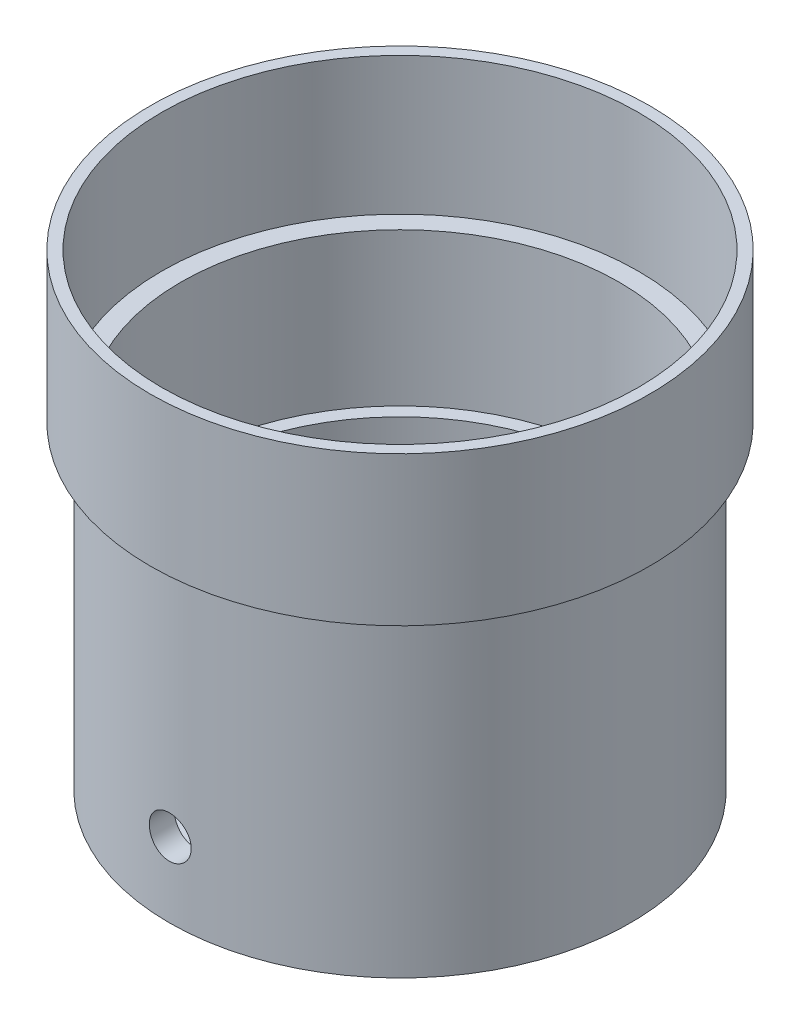
ISO-10303-21;
HEADER;
FILE_DESCRIPTION(('STEP AP214'),'2;1');
FILE_NAME('part.step','',(''),(''),'','','');
FILE_SCHEMA(('AUTOMOTIVE_DESIGN { 1 0 10303 214 1 1 1 1 }'));
ENDSEC;
DATA;
#1=APPLICATION_CONTEXT('core data for automotive mechanical design processes');
#2=APPLICATION_PROTOCOL_DEFINITION('international standard','automotive_design',2000,#1);
#3=PRODUCT_CONTEXT('',#1,'mechanical');
#4=PRODUCT('Part','Part','',(#3));
#5=PRODUCT_RELATED_PRODUCT_CATEGORY('part','',(#4));
#6=PRODUCT_DEFINITION_FORMATION('','',#4);
#7=PRODUCT_DEFINITION_CONTEXT('part definition',#1,'design');
#8=PRODUCT_DEFINITION('design','',#6,#7);
#9=PRODUCT_DEFINITION_SHAPE('','',#8);
#10=(LENGTH_UNIT() NAMED_UNIT(*) SI_UNIT(.MILLI.,.METRE.));
#11=(NAMED_UNIT(*) PLANE_ANGLE_UNIT() SI_UNIT($,.RADIAN.));
#12=(NAMED_UNIT(*) SI_UNIT($,.STERADIAN.) SOLID_ANGLE_UNIT());
#13=UNCERTAINTY_MEASURE_WITH_UNIT(LENGTH_MEASURE(1.E-05),#10,'distance_accuracy_value','');
#14=(GEOMETRIC_REPRESENTATION_CONTEXT(3) GLOBAL_UNCERTAINTY_ASSIGNED_CONTEXT((#13)) GLOBAL_UNIT_ASSIGNED_CONTEXT((#10,
#11,#12)) REPRESENTATION_CONTEXT('',''));
#15=CARTESIAN_POINT('',(0.,0.,0.));
#16=DIRECTION('',(0.,0.,1.));
#17=DIRECTION('',(1.,0.,0.));
#18=AXIS2_PLACEMENT_3D('',#15,#16,#17);
#19=CARTESIAN_POINT('',(0.,0.,0.));
#20=DIRECTION('',(0.,-1.,0.));
#21=DIRECTION('',(0.,0.,-1.));
#22=AXIS2_PLACEMENT_3D('',#19,#20,#21);
#23=CYLINDRICAL_SURFACE('',#22,60.475);
#24=CARTESIAN_POINT('',(0.,-4.,0.));
#25=DIRECTION('',(0.,-1.,0.));
#26=DIRECTION('',(0.,0.,-1.));
#27=AXIS2_PLACEMENT_3D('',#24,#25,#26);
#28=CIRCLE('',#27,60.475);
#29=CARTESIAN_POINT('',(0.,-4.,-60.475));
#30=VERTEX_POINT('',#29);
#31=EDGE_CURVE('E76',#30,#30,#28,.T.);
#32=ORIENTED_EDGE('',*,*,#31,.F.);
#33=EDGE_LOOP('',(#32));
#34=FACE_BOUND('',#33,.T.);
#35=CARTESIAN_POINT('',(0.,79.5,0.));
#36=DIRECTION('',(0.,-1.,0.));
#37=DIRECTION('',(0.,0.,-1.));
#38=AXIS2_PLACEMENT_3D('',#35,#36,#37);
#39=CIRCLE('',#38,60.475);
#40=CARTESIAN_POINT('',(0.,79.5,-60.475));
#41=VERTEX_POINT('',#40);
#42=EDGE_CURVE('E10',#41,#41,#39,.T.);
#43=ORIENTED_EDGE('',*,*,#42,.T.);
#44=EDGE_LOOP('',(#43));
#45=FACE_BOUND('',#44,.T.);
#46=CARTESIAN_POINT('',(-5.5,15.5,60.2243773317749));
#47=CARTESIAN_POINT('',(-5.50000144194168,15.6541803315462,60.2243769684878));
#48=CARTESIAN_POINT('',(-5.49351435754736,15.8083383862626,60.224970628469));
#49=CARTESIAN_POINT('',(-5.46761368127068,16.1156053969008,60.2273276979731));
#50=CARTESIAN_POINT('',(-5.44819693684003,16.2687140877633,60.2290913927769));
#51=CARTESIAN_POINT('',(-5.39655263206254,16.5728631732379,60.2337406625212));
#52=CARTESIAN_POINT('',(-5.36431464859518,16.7239017813601,60.2366271502024));
#53=CARTESIAN_POINT('',(-5.28724890009706,17.0227678330429,60.2434404708375));
#54=CARTESIAN_POINT('',(-5.24241652848806,17.1705940802819,60.2473676844219));
#55=CARTESIAN_POINT('',(-5.14054021720708,17.4617893298028,60.2561455806451));
#56=CARTESIAN_POINT('',(-5.08350798342523,17.6051624549355,60.2609953775655));
#57=CARTESIAN_POINT('',(-4.95759298181546,17.8866402354138,60.271484856631));
#58=CARTESIAN_POINT('',(-4.88870585083432,18.0247429280499,60.2771248294552));
#59=CARTESIAN_POINT('',(-4.73963062986568,18.2945743798621,60.2890297771893));
#60=CARTESIAN_POINT('',(-4.65944911776369,18.4263067895469,60.2952943876922));
#61=CARTESIAN_POINT('',(-4.48829136107303,18.6826083461509,60.3082766379306));
#62=CARTESIAN_POINT('',(-4.39731113085889,18.8071748229031,60.314994444536));
#63=CARTESIAN_POINT('',(-4.20499749490853,19.048500667894,60.3287073651363));
#64=CARTESIAN_POINT('',(-4.10364051668548,19.1652412170232,60.3357030873876));
#65=CARTESIAN_POINT('',(-3.89142517159073,19.389818322349,60.3497617567296));
#66=CARTESIAN_POINT('',(-3.78056330709322,19.497651571913,60.3568247277095));
#67=CARTESIAN_POINT('',(-3.55018785333809,19.7035731796975,60.3708133155754));
#68=CARTESIAN_POINT('',(-3.43067707639296,19.8016646811877,60.3777389761848));
#69=CARTESIAN_POINT('',(-3.18376656973002,19.9874840407185,60.391262159261));
#70=CARTESIAN_POINT('',(-3.0563639450787,20.075208060974,60.3978595596941));
#71=CARTESIAN_POINT('',(-2.79442635305351,20.2397397610876,60.4105455821035));
#72=CARTESIAN_POINT('',(-2.6598818949265,20.3165323890479,60.4166334978882));
#73=CARTESIAN_POINT('',(-2.38472484990477,20.4585350171856,60.4281199786119));
#74=CARTESIAN_POINT('',(-2.24411003506828,20.5237407190287,60.4335182875235));
#75=CARTESIAN_POINT('',(-1.95789773152687,20.6420416287933,60.4434672422761));
#76=CARTESIAN_POINT('',(-1.8123021859682,20.6951414990043,60.4480182143256));
#77=CARTESIAN_POINT('',(-1.51711480578658,20.7888931502244,60.456148308385));
#78=CARTESIAN_POINT('',(-1.36752152060262,20.8295403442895,60.459727072227));
#79=CARTESIAN_POINT('',(-0.915288255428919,20.9320685921761,60.4688192176509));
#80=CARTESIAN_POINT('',(-0.608074651657578,20.9749979406864,60.4727285941149));
#81=CARTESIAN_POINT('',(0.00905334258165068,21.0086796522335,60.4757880295455));
#82=CARTESIAN_POINT('',(0.318967674068777,20.9994331518933,60.474938192189));
#83=CARTESIAN_POINT('',(0.931938416084447,20.9292097248113,60.4685929908865));
#84=CARTESIAN_POINT('',(1.23501239252568,20.8683858136857,60.4631113683103));
#85=CARTESIAN_POINT('',(1.82662000204596,20.6969540805659,60.4481325550474));
#86=CARTESIAN_POINT('',(2.11515347453505,20.58634570887,60.4386353200218));
#87=CARTESIAN_POINT('',(2.66998931641287,20.3183202954448,60.4166703511368));
#88=CARTESIAN_POINT('',(2.936258570487,20.1608350624714,60.4041982951265));
#89=CARTESIAN_POINT('',(3.43864221756736,19.8035745635336,60.3776842038219));
#90=CARTESIAN_POINT('',(3.67475588010329,19.6037982734485,60.363642130512));
#91=CARTESIAN_POINT('',(4.11102259328823,19.1667650769358,60.3355051530854));
#92=CARTESIAN_POINT('',(4.31104237150202,18.929375107772,60.3214102417353));
#93=CARTESIAN_POINT('',(4.66841263298923,18.424315774095,60.2948071086337));
#94=CARTESIAN_POINT('',(4.82576307053349,18.1566463771314,60.2822988885826));
#95=CARTESIAN_POINT('',(5.09332497426873,17.5985289467483,60.2602835973969));
#96=CARTESIAN_POINT('',(5.20352895260322,17.3080773036873,60.2507770030469));
#97=CARTESIAN_POINT('',(5.37356801390697,16.7126874606261,60.2358509683223));
#98=CARTESIAN_POINT('',(5.43340436152038,16.4077496245524,60.2304314253292));
#99=CARTESIAN_POINT('',(5.50083973891706,15.7932113105547,60.2243103070085));
#100=CARTESIAN_POINT('',(5.50862487947157,15.4836314156615,60.2235919227321));
#101=CARTESIAN_POINT('',(5.4722249032703,14.8675711977102,60.2269101028749));
#102=CARTESIAN_POINT('',(5.42804036545704,14.5610908401616,60.2309466143245));
#103=CARTESIAN_POINT('',(5.28911068724888,13.9604673947471,60.2433044666382));
#104=CARTESIAN_POINT('',(5.19445289830432,13.666303936409,60.2516184039118));
#105=CARTESIAN_POINT('',(4.95735258918094,13.0980325566026,60.2715882637784));
#106=CARTESIAN_POINT('',(4.81490915899044,12.8239250171928,60.2832442500156));
#107=CARTESIAN_POINT('',(4.48581241822947,12.3026961508955,60.3086256160049));
#108=CARTESIAN_POINT('',(4.29903538869897,12.0556532231758,60.3223567470561));
#109=CARTESIAN_POINT('',(3.88675035252676,11.596359855306,60.3503220657683));
#110=CARTESIAN_POINT('',(3.66124155283631,11.3841101277348,60.364556263725));
#111=CARTESIAN_POINT('',(3.17709284735999,10.9997896238373,60.3919743362026));
#112=CARTESIAN_POINT('',(2.91835658538405,10.8278399808376,60.4051549676323));
#113=CARTESIAN_POINT('',(2.37556043504848,10.5298344396475,60.4289335281881));
#114=CARTESIAN_POINT('',(2.09150084101561,10.4037780081384,60.4395314873267));
#115=CARTESIAN_POINT('',(1.50660819591552,10.2013380870268,60.4569370777865));
#116=CARTESIAN_POINT('',(1.20580091395813,10.1248804561308,60.4637503643119));
#117=CARTESIAN_POINT('',(0.595384792994582,10.0235883129392,60.4728372759292));
#118=CARTESIAN_POINT('',(0.285776155785266,9.99875261802575,60.4751110050188));
#119=CARTESIAN_POINT('',(-0.177597204593095,10.0006967187348,60.4749378527973));
#120=CARTESIAN_POINT('',(-0.331686319593113,10.0078437873047,60.4742859423681));
#121=CARTESIAN_POINT('',(-0.638696704630235,10.0350417742214,60.4718212990253));
#122=CARTESIAN_POINT('',(-0.79161838645268,10.05508790764,60.4700089965621));
#123=CARTESIAN_POINT('',(-1.09526665726559,10.1079538085662,60.4652718972172));
#124=CARTESIAN_POINT('',(-1.2459924192718,10.1407782656566,60.4623466919144));
#125=CARTESIAN_POINT('',(-1.54408184207406,10.2189451579375,60.4554683132502));
#126=CARTESIAN_POINT('',(-1.6914467131662,10.2642830073142,60.4515155165035));
#127=CARTESIAN_POINT('',(-1.981866188213,10.3671697303595,60.4426914263128));
#128=CARTESIAN_POINT('',(-2.1249196028145,10.424721938886,60.4378198820659));
#129=CARTESIAN_POINT('',(-2.40561626560247,10.5515938707401,60.4272980997014));
#130=CARTESIAN_POINT('',(-2.54326147200452,10.6209092855522,60.421648146834));
#131=CARTESIAN_POINT('',(-2.81227884835731,10.7708552947685,60.4097247988));
#132=CARTESIAN_POINT('',(-2.94364880577517,10.8514898411864,60.4034511861102));
#133=CARTESIAN_POINT('',(-3.19909845796093,11.0234536627207,60.3904607302381));
#134=CARTESIAN_POINT('',(-3.32318078672044,11.114779037647,60.3837440490825));
#135=CARTESIAN_POINT('',(-3.56370134999259,11.3078755232719,60.3700275469708));
#136=CARTESIAN_POINT('',(-3.68010848554904,11.4096853036774,60.3630267400639));
#137=CARTESIAN_POINT('',(-3.90389660234442,11.6227010742974,60.3489667271439));
#138=CARTESIAN_POINT('',(-4.01128086823052,11.7339036153903,60.341907543419));
#139=CARTESIAN_POINT('',(-4.21637794407548,11.9650258824869,60.3279235266718));
#140=CARTESIAN_POINT('',(-4.31408481391058,12.0849508851009,60.3209987782385));
#141=CARTESIAN_POINT('',(-4.49902756305204,12.3325685616302,60.3074868718415));
#142=CARTESIAN_POINT('',(-4.58626729422208,12.4602583519092,60.300899590206));
#143=CARTESIAN_POINT('',(-4.74990592008288,12.7228808225798,60.2882308062477));
#144=CARTESIAN_POINT('',(-4.82627676004448,12.8578310504918,60.2821506290082));
#145=CARTESIAN_POINT('',(-4.96733970651611,13.1336685243862,60.2706907995833));
#146=CARTESIAN_POINT('',(-5.03203608723124,13.2745535741396,60.2653108912202));
#147=CARTESIAN_POINT('',(-5.14926893615989,13.5611904248172,60.2554073609372));
#148=CARTESIAN_POINT('',(-5.20181551045435,13.7069380647654,60.2508830279335));
#149=CARTESIAN_POINT('',(-5.29442341206908,14.0023221279602,60.2428158466783));
#150=CARTESIAN_POINT('',(-5.33448784373703,14.1519575742515,60.2392727544135));
#151=CARTESIAN_POINT('',(-5.41192797052756,14.4992817005471,60.2323718968821));
#152=CARTESIAN_POINT('',(-5.44492389239092,14.6979699993886,60.2293857851102));
#153=CARTESIAN_POINT('',(-5.48895893039545,15.0977848355471,60.2253887427393));
#154=CARTESIAN_POINT('',(-5.4999981193575,15.2989113647752,60.2243778055895));
#155=CARTESIAN_POINT('',(-5.5,15.5,60.2243773317749));
#156=B_SPLINE_CURVE_WITH_KNOTS('',3,(#46,#47,#48,#49,#50,#51,#52,#53,#54,#55,#56,#57,#58,#59,
#60,#61,#62,#63,#64,#65,#66,#67,#68,#69,#70,#71,#72,#73,#74,#75,#76,#77,#78,#79,#80,#81,#82,#83,
#84,#85,#86,#87,#88,#89,#90,#91,#92,#93,#94,#95,#96,#97,#98,#99,#100,#101,#102,#103,#104,#105,
#106,#107,#108,#109,#110,#111,#112,#113,#114,#115,#116,#117,#118,#119,#120,#121,#122,#123,#124,
#125,#126,#127,#128,#129,#130,#131,#132,#133,#134,#135,#136,#137,#138,#139,#140,#141,#142,#143,
#144,#145,#146,#147,#148,#149,#150,#151,#152,#153,#154,#155),.UNSPECIFIED.,.T.,.F.,(4,2,2,2,2,2,
2,2,2,2,2,2,2,2,2,2,2,2,2,2,2,2,2,2,2,2,2,2,2,2,2,2,2,2,2,2,2,2,2,2,2,2,2,2,2,2,2,2,2,2,2,2,2,2,
4),(0.,0.462365174282423,0.924843125119683,1.38769782187072,1.85072203529113,2.31330394934615,
2.77605648058929,3.23854060903502,3.7011959665194,4.16492667897097,4.62882877440598,
5.09258069766596,5.55650375624409,6.02105955594189,6.48578733104917,6.95033582318753,
7.41505522661891,8.3409033953241,9.26673139499885,10.1898222952546,11.1129233881872,
12.0373739236104,12.9618468481028,13.8896663864806,14.817486919208,15.7454547548355,
16.6733992900996,17.5980241470867,18.5226387038449,19.4456582469941,20.368695368776,
21.2943392801033,22.220002146626,23.1484126594543,24.0768123830056,25.0038210982645,
25.9308085762483,26.3931272884561,26.8552746016058,27.3175916807129,27.779739557789,
28.2420137767232,28.7041190422465,29.1663860524904,29.6284849426227,30.0923537749475,
30.5560530041417,31.0200351172054,31.4838459596501,31.9488330799651,32.4136496141688,
32.8780781167406,33.3423910221253,33.9454296153304,34.5484662085166),.UNSPECIFIED.);
#157=CARTESIAN_POINT('',(-5.5,15.5,60.2243773317749));
#158=VERTEX_POINT('',#157);
#159=EDGE_CURVE('E79',#158,#158,#156,.T.);
#160=ORIENTED_EDGE('',*,*,#159,.T.);
#161=EDGE_LOOP('',(#160));
#162=FACE_BOUND('',#161,.T.);
#163=ADVANCED_FACE('F36',(#34,#45,#162),#23,.T.);
#164=CARTESIAN_POINT('',(0.,0.,0.));
#165=DIRECTION('',(0.,-1.,0.));
#166=DIRECTION('',(0.,0.,-1.));
#167=AXIS2_PLACEMENT_3D('',#164,#165,#166);
#168=CYLINDRICAL_SURFACE('',#167,53.975);
#169=CARTESIAN_POINT('',(0.,42.5,0.));
#170=DIRECTION('',(0.,-1.,0.));
#171=DIRECTION('',(0.,0.,-1.));
#172=AXIS2_PLACEMENT_3D('',#169,#170,#171);
#173=CIRCLE('',#172,53.975);
#174=CARTESIAN_POINT('',(0.,42.5,-53.975));
#175=VERTEX_POINT('',#174);
#176=EDGE_CURVE('E70',#175,#175,#173,.T.);
#177=ORIENTED_EDGE('',*,*,#176,.F.);
#178=EDGE_LOOP('',(#177));
#179=FACE_BOUND('',#178,.T.);
#180=CARTESIAN_POINT('',(0.,0.,0.));
#181=DIRECTION('',(0.,-1.,0.));
#182=DIRECTION('',(0.,0.,-1.));
#183=AXIS2_PLACEMENT_3D('',#180,#181,#182);
#184=CIRCLE('',#183,53.975);
#185=CARTESIAN_POINT('',(0.,0.,-53.975));
#186=VERTEX_POINT('',#185);
#187=EDGE_CURVE('E73',#186,#186,#184,.T.);
#188=ORIENTED_EDGE('',*,*,#187,.T.);
#189=EDGE_LOOP('',(#188));
#190=FACE_BOUND('',#189,.T.);
#191=CARTESIAN_POINT('',(-5.5,15.5,53.6940464576847));
#192=CARTESIAN_POINT('',(-5.50000153240428,15.3459076315923,53.6940460256617));
#193=CARTESIAN_POINT('',(-5.4935218031051,15.1918385855872,53.6947111448561));
#194=CARTESIAN_POINT('',(-5.46765111703409,14.8847502316576,53.6973518217362));
#195=CARTESIAN_POINT('',(-5.44825707496244,14.7317311834113,53.6993276925672));
#196=CARTESIAN_POINT('',(-5.39667472743171,14.4277650210896,53.7045360842844));
#197=CARTESIAN_POINT('',(-5.36447626376089,14.2768196507378,53.7077696028633));
#198=CARTESIAN_POINT('',(-5.28750717870828,13.9781395947648,53.7154017743754));
#199=CARTESIAN_POINT('',(-5.2427319555295,13.8304061057184,53.7198008537502));
#200=CARTESIAN_POINT('',(-5.14098989854649,13.5393982412645,53.7296329300752));
#201=CARTESIAN_POINT('',(-5.08403509734705,13.396119623609,53.7350649060102));
#202=CARTESIAN_POINT('',(-4.95829474318958,13.1148257568675,53.7468131543168));
#203=CARTESIAN_POINT('',(-4.88950483388677,12.9768124688142,53.7531297521461));
#204=CARTESIAN_POINT('',(-4.74064278973354,12.7071498380514,53.7664626799588));
#205=CARTESIAN_POINT('',(-4.66057711419056,12.5754969094071,53.7734786086639));
#206=CARTESIAN_POINT('',(-4.48966909749034,12.3193418094352,53.7880177283907));
#207=CARTESIAN_POINT('',(-4.39882277422464,12.1948423057682,53.7955411064063));
#208=CARTESIAN_POINT('',(-4.2067293932701,11.9535540787597,53.8109037375464));
#209=CARTESIAN_POINT('',(-4.10545208434623,11.8367894938543,53.8187438669218));
#210=CARTESIAN_POINT('',(-3.89339644764286,11.6121561317142,53.8345000329384));
#211=CARTESIAN_POINT('',(-3.7826146216183,11.5042906588002,53.8424160965675));
#212=CARTESIAN_POINT('',(-3.55239669273259,11.2982945645204,53.8580950865359));
#213=CARTESIAN_POINT('',(-3.43296338877997,11.2001608188911,53.8658580613772));
#214=CARTESIAN_POINT('',(-3.18620252022825,11.0142462772381,53.8810172653351));
#215=CARTESIAN_POINT('',(-3.05887205908591,10.9264693145789,53.8884133580739));
#216=CARTESIAN_POINT('',(-2.79701134388464,10.7617838222323,53.9026397474969));
#217=CARTESIAN_POINT('',(-2.66246843416988,10.6848953203395,53.9094689922382));
#218=CARTESIAN_POINT('',(-2.38729859867522,10.542702062064,53.9223554053862));
#219=CARTESIAN_POINT('',(-2.24666943753227,10.4774016074373,53.9284122868397));
#220=CARTESIAN_POINT('',(-1.96041274690425,10.3589150293598,53.9395762896411));
#221=CARTESIAN_POINT('',(-1.81478718597118,10.3057241964509,53.944683780067));
#222=CARTESIAN_POINT('',(-1.5195245225479,10.2117968285308,53.9538095619937));
#223=CARTESIAN_POINT('',(-1.36988596520419,10.1710648785527,53.9578274524458));
#224=CARTESIAN_POINT('',(-0.917710378979365,10.0683448329436,53.9680331448027));
#225=CARTESIAN_POINT('',(-0.610587826867867,10.0252855589828,53.9724262545292));
#226=CARTESIAN_POINT('',(0.00638683431665454,9.99132055965389,53.975882862156));
#227=CARTESIAN_POINT('',(0.316238869890342,10.0004134341969,53.9749465031325));
#228=CARTESIAN_POINT('',(0.928869386473039,10.0702815942413,53.9678726514243));
#229=CARTESIAN_POINT('',(1.2316698473869,10.1308649927705,53.9617544698538));
#230=CARTESIAN_POINT('',(1.82277056315143,10.3017136671312,53.9450242504474));
#231=CARTESIAN_POINT('',(2.11107062341695,10.4119796094698,53.9344121523245));
#232=CARTESIAN_POINT('',(2.66560560958937,10.6792684781589,53.9098545692303));
#233=CARTESIAN_POINT('',(2.93179938501973,10.8363762111097,53.8959030473773));
#234=CARTESIAN_POINT('',(3.43411255421383,11.1928286634604,53.8662316068177));
#235=CARTESIAN_POINT('',(3.67023103154075,11.3921746694273,53.8505116342514));
#236=CARTESIAN_POINT('',(4.10681657408032,11.8285237900032,53.818982803668));
#237=CARTESIAN_POINT('',(4.30711677061497,12.0656938960783,53.8031738663307));
#238=CARTESIAN_POINT('',(4.66508744278389,12.5703803066585,53.773320088622));
#239=CARTESIAN_POINT('',(4.82275785262697,12.8378966579965,53.7592752509732));
#240=CARTESIAN_POINT('',(5.0909932409585,13.3958113600366,53.7345387073039));
#241=CARTESIAN_POINT('',(5.20154770232727,13.6862148024218,53.7238477500697));
#242=CARTESIAN_POINT('',(5.3722797988329,14.2815958934369,53.7070447908082));
#243=CARTESIAN_POINT('',(5.43245902889118,14.5865730803269,53.7009326438126));
#244=CARTESIAN_POINT('',(5.50051731783101,15.200978934336,53.6940045181653));
#245=CARTESIAN_POINT('',(5.50862992176898,15.5103814755912,53.6931648899761));
#246=CARTESIAN_POINT('',(5.47293820022411,16.1261415656932,53.6968144459062));
#247=CARTESIAN_POINT('',(5.42913460364245,16.4324991572299,53.7013035552102));
#248=CARTESIAN_POINT('',(5.29104940753336,17.0327909269896,53.7150832534855));
#249=CARTESIAN_POINT('',(5.19687841854171,17.3267508111505,53.7243633196138));
#250=CARTESIAN_POINT('',(4.96084451485488,17.8947021151077,53.7466707543434));
#251=CARTESIAN_POINT('',(4.81898046716918,18.1686930603361,53.7596982119664));
#252=CARTESIAN_POINT('',(4.49100342982999,18.6899928865871,53.7880897683468));
#253=CARTESIAN_POINT('',(4.30473579025241,18.9372040208873,53.8034619644757));
#254=CARTESIAN_POINT('',(3.8934593736692,19.3969350597664,53.8347844729075));
#255=CARTESIAN_POINT('',(3.66844960045227,19.6094540720019,53.8507348000681));
#256=CARTESIAN_POINT('',(3.18506658852614,19.9945750539455,53.8814879370951));
#257=CARTESIAN_POINT('',(2.92657159033469,20.1670245942709,53.8962862270426));
#258=CARTESIAN_POINT('',(2.38414124071434,20.4660605411817,53.923001608027));
#259=CARTESIAN_POINT('',(2.10020624952846,20.592647597075,53.9349187398538));
#260=CARTESIAN_POINT('',(1.51554382039914,20.7961132309695,53.9545100828234));
#261=CARTESIAN_POINT('',(1.21484851384892,20.8730835946848,53.9621921246068));
#262=CARTESIAN_POINT('',(0.604550804685854,20.9754087488837,53.9724746240337));
#263=CARTESIAN_POINT('',(0.294948662949551,21.0007650495584,53.9750752303563));
#264=CARTESIAN_POINT('',(-0.168336364751904,20.9995910834442,53.9749596908162));
#265=CARTESIAN_POINT('',(-0.322311804474553,20.9927108023837,53.9742564560784));
#266=CARTESIAN_POINT('',(-0.629116867793943,20.9660657494598,53.9715507044686));
#267=CARTESIAN_POINT('',(-0.781946895503812,20.9463057612972,53.96954866999));
#268=CARTESIAN_POINT('',(-1.08543417120274,20.8940303942188,53.9642986068357));
#269=CARTESIAN_POINT('',(-1.23609060296469,20.8615103465926,53.9610501221124));
#270=CARTESIAN_POINT('',(-1.5340650812583,20.7839693274932,53.9534008911425));
#271=CARTESIAN_POINT('',(-1.68138432705435,20.7389529263902,53.9490005661991));
#272=CARTESIAN_POINT('',(-1.9717289584688,20.6367284162881,53.939169607022));
#273=CARTESIAN_POINT('',(-2.11475342599364,20.5795177213896,53.9337387542834));
#274=CARTESIAN_POINT('',(-2.39542082661984,20.4533446924178,53.9220020674856));
#275=CARTESIAN_POINT('',(-2.53306570281523,20.3843866505957,53.9156965531666));
#276=CARTESIAN_POINT('',(-2.80211482189688,20.2351688886079,53.9023833259385));
#277=CARTESIAN_POINT('',(-2.93351683257256,20.1549051660327,53.8953753646054));
#278=CARTESIAN_POINT('',(-3.18906600178407,19.9836931640948,53.8808580054519));
#279=CARTESIAN_POINT('',(-3.31321577149091,19.8927487662617,53.8733487902209));
#280=CARTESIAN_POINT('',(-3.55401795285956,19.7003357498558,53.8580004138454));
#281=CARTESIAN_POINT('',(-3.6706321640709,19.5988194305925,53.8501598612435));
#282=CARTESIAN_POINT('',(-3.89485994452759,19.3863749413546,53.8344064848914));
#283=CARTESIAN_POINT('',(-4.00247678126327,19.2754502178808,53.8264936885453));
#284=CARTESIAN_POINT('',(-4.20806482957428,19.0448644246271,53.8108116775406));
#285=CARTESIAN_POINT('',(-4.3060301331772,18.9251980809421,53.8030425531619));
#286=CARTESIAN_POINT('',(-4.49151498227166,18.6780738311309,53.7878757436077));
#287=CARTESIAN_POINT('',(-4.57903837107248,18.5506188180287,53.7804779223527));
#288=CARTESIAN_POINT('',(-4.7433074537974,18.2883766892341,53.7662392214232));
#289=CARTESIAN_POINT('',(-4.82001994468429,18.1535686765527,53.7594000835294));
#290=CARTESIAN_POINT('',(-4.96177597795614,17.8779786530793,53.7465019336578));
#291=CARTESIAN_POINT('',(-5.02682379419994,17.737198853784,53.7404426361825));
#292=CARTESIAN_POINT('',(-5.14476584926793,17.4507319176217,53.7292799098444));
#293=CARTESIAN_POINT('',(-5.19767001453193,17.3050489012422,53.7241757009103));
#294=CARTESIAN_POINT('',(-5.29099387801653,17.0097557305358,53.7150649412015));
#295=CARTESIAN_POINT('',(-5.3314166352558,16.8601465482254,53.7110581214993));
#296=CARTESIAN_POINT('',(-5.41010860404909,16.5109190831507,53.7031972934541));
#297=CARTESIAN_POINT('',(-5.44378530721334,16.3102388822633,53.6997796153202));
#298=CARTESIAN_POINT('',(-5.48872994567608,15.9063589335109,53.6952044872062));
#299=CARTESIAN_POINT('',(-5.49999797964023,15.7031591967436,53.6940470272744));
#300=CARTESIAN_POINT('',(-5.5,15.5,53.6940464576847));
#301=B_SPLINE_CURVE_WITH_KNOTS('',3,(#191,#192,#193,#194,#195,#196,#197,#198,#199,#200,#201,
#202,#203,#204,#205,#206,#207,#208,#209,#210,#211,#212,#213,#214,#215,#216,#217,#218,#219,#220,
#221,#222,#223,#224,#225,#226,#227,#228,#229,#230,#231,#232,#233,#234,#235,#236,#237,#238,#239,
#240,#241,#242,#243,#244,#245,#246,#247,#248,#249,#250,#251,#252,#253,#254,#255,#256,#257,#258,
#259,#260,#261,#262,#263,#264,#265,#266,#267,#268,#269,#270,#271,#272,#273,#274,#275,#276,#277,
#278,#279,#280,#281,#282,#283,#284,#285,#286,#287,#288,#289,#290,#291,#292,#293,#294,#295,#296,
#297,#298,#299,#300),.UNSPECIFIED.,.T.,.F.,(4,2,2,2,2,2,2,2,2,2,2,2,2,2,2,2,2,2,2,2,2,2,2,2,2,2,
2,2,2,2,2,2,2,2,2,2,2,2,2,2,2,2,2,2,2,2,2,2,2,2,2,2,2,2,4),(0.,0.462099424456543,
0.924309286615233,1.38688657048311,1.84963333090998,2.31192502338969,2.77438724473748,
3.23658561475182,3.69895524411946,4.16270572709286,4.62662763701125,5.09040012446097,
5.55434373345724,6.0191299156551,6.48408827813167,6.94886550722631,7.41381357523903,
8.33945940947862,9.26508039372813,10.1872669651062,11.1094659082789,12.033344728364,
12.957251693611,13.8853567283873,14.8134631955138,15.741776724179,16.6700608605595,
17.5941782474838,18.5182826599939,19.4403659534365,20.3624711533262,21.2878360522266,
22.2132247494207,23.1420781238072,24.070918347244,24.9980353442495,25.9251252140744,
26.387067836955,26.8488389856717,27.3107792471713,27.7725507824307,28.2344203377074,
28.6961214954087,29.1579865161617,29.6196842041162,30.0835636113314,30.5472738174488,
31.011266132506,31.4750871376242,31.9403029804386,32.4053480214529,32.8700115616834,
33.334561128814,33.9438071428435,34.5530504743489),.UNSPECIFIED.);
#302=CARTESIAN_POINT('',(-5.5,15.5,53.6940464576847));
#303=VERTEX_POINT('',#302);
#304=EDGE_CURVE('E40',#303,#303,#301,.T.);
#305=ORIENTED_EDGE('',*,*,#304,.T.);
#306=EDGE_LOOP('',(#305));
#307=FACE_BOUND('',#306,.T.);
#308=ADVANCED_FACE('F98',(#179,#190,#307),#168,.F.);
#309=CARTESIAN_POINT('',(65.475,79.5,0.));
#310=DIRECTION('',(0.,-1.,0.));
#311=DIRECTION('',(0.,0.,-1.));
#312=AXIS2_PLACEMENT_3D('',#309,#310,#311);
#313=PLANE('',#312);
#314=CARTESIAN_POINT('',(0.,79.5,0.));
#315=DIRECTION('',(0.,-1.,0.));
#316=DIRECTION('',(0.,0.,-1.));
#317=AXIS2_PLACEMENT_3D('',#314,#315,#316);
#318=CIRCLE('',#317,65.475);
#319=CARTESIAN_POINT('',(0.,79.5,-65.475));
#320=VERTEX_POINT('',#319);
#321=EDGE_CURVE('E49',#320,#320,#318,.T.);
#322=ORIENTED_EDGE('',*,*,#321,.T.);
#323=EDGE_LOOP('',(#322));
#324=FACE_BOUND('',#323,.T.);
#325=ORIENTED_EDGE('',*,*,#42,.F.);
#326=EDGE_LOOP('',(#325));
#327=FACE_BOUND('',#326,.T.);
#328=ADVANCED_FACE('F102',(#324,#327),#313,.T.);
#329=CARTESIAN_POINT('',(0.,0.,0.));
#330=DIRECTION('',(0.,-1.,0.));
#331=DIRECTION('',(0.,0.,-1.));
#332=AXIS2_PLACEMENT_3D('',#329,#330,#331);
#333=CYLINDRICAL_SURFACE('',#332,65.475);
#334=CARTESIAN_POINT('',(0.,118.56,0.));
#335=DIRECTION('',(0.,-1.,0.));
#336=DIRECTION('',(0.,0.,-1.));
#337=AXIS2_PLACEMENT_3D('',#334,#335,#336);
#338=CIRCLE('',#337,65.475);
#339=CARTESIAN_POINT('',(0.,118.56,-65.475));
#340=VERTEX_POINT('',#339);
#341=EDGE_CURVE('E53',#340,#340,#338,.T.);
#342=ORIENTED_EDGE('',*,*,#341,.T.);
#343=EDGE_LOOP('',(#342));
#344=FACE_BOUND('',#343,.T.);
#345=ORIENTED_EDGE('',*,*,#321,.F.);
#346=EDGE_LOOP('',(#345));
#347=FACE_BOUND('',#346,.T.);
#348=ADVANCED_FACE('F122',(#344,#347),#333,.T.);
#349=CARTESIAN_POINT('',(62.475,118.56,0.));
#350=DIRECTION('',(0.,1.,0.));
#351=DIRECTION('',(0.,0.,1.));
#352=AXIS2_PLACEMENT_3D('',#349,#350,#351);
#353=PLANE('',#352);
#354=CARTESIAN_POINT('',(0.,118.56,0.));
#355=DIRECTION('',(0.,-1.,0.));
#356=DIRECTION('',(0.,0.,-1.));
#357=AXIS2_PLACEMENT_3D('',#354,#355,#356);
#358=CIRCLE('',#357,62.475);
#359=CARTESIAN_POINT('',(0.,118.56,-62.475));
#360=VERTEX_POINT('',#359);
#361=EDGE_CURVE('E58',#360,#360,#358,.T.);
#362=ORIENTED_EDGE('',*,*,#361,.T.);
#363=EDGE_LOOP('',(#362));
#364=FACE_BOUND('',#363,.T.);
#365=ORIENTED_EDGE('',*,*,#341,.F.);
#366=EDGE_LOOP('',(#365));
#367=FACE_BOUND('',#366,.T.);
#368=ADVANCED_FACE('F118',(#364,#367),#353,.T.);
#369=CARTESIAN_POINT('',(0.,0.,0.));
#370=DIRECTION('',(0.,-1.,0.));
#371=DIRECTION('',(0.,0.,-1.));
#372=AXIS2_PLACEMENT_3D('',#369,#370,#371);
#373=CYLINDRICAL_SURFACE('',#372,62.475);
#374=CARTESIAN_POINT('',(0.,82.5,0.));
#375=DIRECTION('',(0.,-1.,0.));
#376=DIRECTION('',(0.,0.,-1.));
#377=AXIS2_PLACEMENT_3D('',#374,#375,#376);
#378=CIRCLE('',#377,62.475);
#379=CARTESIAN_POINT('',(0.,82.5,-62.475));
#380=VERTEX_POINT('',#379);
#381=EDGE_CURVE('E61',#380,#380,#378,.T.);
#382=ORIENTED_EDGE('',*,*,#381,.T.);
#383=EDGE_LOOP('',(#382));
#384=FACE_BOUND('',#383,.T.);
#385=ORIENTED_EDGE('',*,*,#361,.F.);
#386=EDGE_LOOP('',(#385));
#387=FACE_BOUND('',#386,.T.);
#388=ADVANCED_FACE('F114',(#384,#387),#373,.F.);
#389=CARTESIAN_POINT('',(57.475,82.5,0.));
#390=DIRECTION('',(0.,1.,0.));
#391=DIRECTION('',(0.,0.,1.));
#392=AXIS2_PLACEMENT_3D('',#389,#390,#391);
#393=PLANE('',#392);
#394=CARTESIAN_POINT('',(0.,82.5,0.));
#395=DIRECTION('',(0.,-1.,0.));
#396=DIRECTION('',(0.,0.,-1.));
#397=AXIS2_PLACEMENT_3D('',#394,#395,#396);
#398=CIRCLE('',#397,57.475);
#399=CARTESIAN_POINT('',(0.,82.5,-57.475));
#400=VERTEX_POINT('',#399);
#401=EDGE_CURVE('E64',#400,#400,#398,.T.);
#402=ORIENTED_EDGE('',*,*,#401,.T.);
#403=EDGE_LOOP('',(#402));
#404=FACE_BOUND('',#403,.T.);
#405=ORIENTED_EDGE('',*,*,#381,.F.);
#406=EDGE_LOOP('',(#405));
#407=FACE_BOUND('',#406,.T.);
#408=ADVANCED_FACE('F110',(#404,#407),#393,.T.);
#409=CARTESIAN_POINT('',(0.,0.,0.));
#410=DIRECTION('',(0.,-1.,0.));
#411=DIRECTION('',(0.,0.,-1.));
#412=AXIS2_PLACEMENT_3D('',#409,#410,#411);
#413=CYLINDRICAL_SURFACE('',#412,57.475);
#414=CARTESIAN_POINT('',(0.,42.5,0.));
#415=DIRECTION('',(0.,-1.,0.));
#416=DIRECTION('',(0.,0.,-1.));
#417=AXIS2_PLACEMENT_3D('',#414,#415,#416);
#418=CIRCLE('',#417,57.475);
#419=CARTESIAN_POINT('',(0.,42.5,-57.475));
#420=VERTEX_POINT('',#419);
#421=EDGE_CURVE('E67',#420,#420,#418,.T.);
#422=ORIENTED_EDGE('',*,*,#421,.T.);
#423=EDGE_LOOP('',(#422));
#424=FACE_BOUND('',#423,.T.);
#425=ORIENTED_EDGE('',*,*,#401,.F.);
#426=EDGE_LOOP('',(#425));
#427=FACE_BOUND('',#426,.T.);
#428=ADVANCED_FACE('F106',(#424,#427),#413,.F.);
#429=CARTESIAN_POINT('',(53.975,42.5,0.));
#430=DIRECTION('',(0.,1.,0.));
#431=DIRECTION('',(0.,0.,1.));
#432=AXIS2_PLACEMENT_3D('',#429,#430,#431);
#433=PLANE('',#432);
#434=ORIENTED_EDGE('',*,*,#176,.T.);
#435=EDGE_LOOP('',(#434));
#436=FACE_BOUND('',#435,.T.);
#437=ORIENTED_EDGE('',*,*,#421,.F.);
#438=EDGE_LOOP('',(#437));
#439=FACE_BOUND('',#438,.T.);
#440=ADVANCED_FACE('F96',(#436,#439),#433,.T.);
#441=CARTESIAN_POINT('',(0.,0.,0.));
#442=DIRECTION('',(0.,-1.,0.));
#443=DIRECTION('',(0.,0.,-1.));
#444=AXIS2_PLACEMENT_3D('',#441,#442,#443);
#445=PLANE('',#444);
#446=ORIENTED_EDGE('',*,*,#187,.F.);
#447=EDGE_LOOP('',(#446));
#448=FACE_BOUND('',#447,.T.);
#449=ADVANCED_FACE('F93',(#448),#445,.F.);
#450=CARTESIAN_POINT('',(0.,-4.,0.));
#451=DIRECTION('',(0.,-1.,0.));
#452=DIRECTION('',(0.,0.,-1.));
#453=AXIS2_PLACEMENT_3D('',#450,#451,#452);
#454=PLANE('',#453);
#455=ORIENTED_EDGE('',*,*,#31,.T.);
#456=EDGE_LOOP('',(#455));
#457=FACE_BOUND('',#456,.T.);
#458=ADVANCED_FACE('F88',(#457),#454,.T.);
#459=CARTESIAN_POINT('',(0.,15.5,65.475));
#460=DIRECTION('',(0.,0.,-1.));
#461=DIRECTION('',(-1.,0.,0.));
#462=AXIS2_PLACEMENT_3D('',#459,#460,#461);
#463=CYLINDRICAL_SURFACE('',#462,5.5);
#464=ORIENTED_EDGE('',*,*,#159,.F.);
#465=EDGE_LOOP('',(#464));
#466=FACE_BOUND('',#465,.T.);
#467=ORIENTED_EDGE('',*,*,#304,.F.);
#468=EDGE_LOOP('',(#467));
#469=FACE_BOUND('',#468,.T.);
#470=ADVANCED_FACE('F84',(#466,#469),#463,.F.);
#471=CLOSED_SHELL('',(#163,#308,#328,#348,#368,#388,#408,#428,#440,#449,#458,#470));
#472=MANIFOLD_SOLID_BREP('B2',#471);
#473=ADVANCED_BREP_SHAPE_REPRESENTATION('',(#18,#472),#14);
#474=SHAPE_DEFINITION_REPRESENTATION(#9,#473);
ENDSEC;
END-ISO-10303-21;
